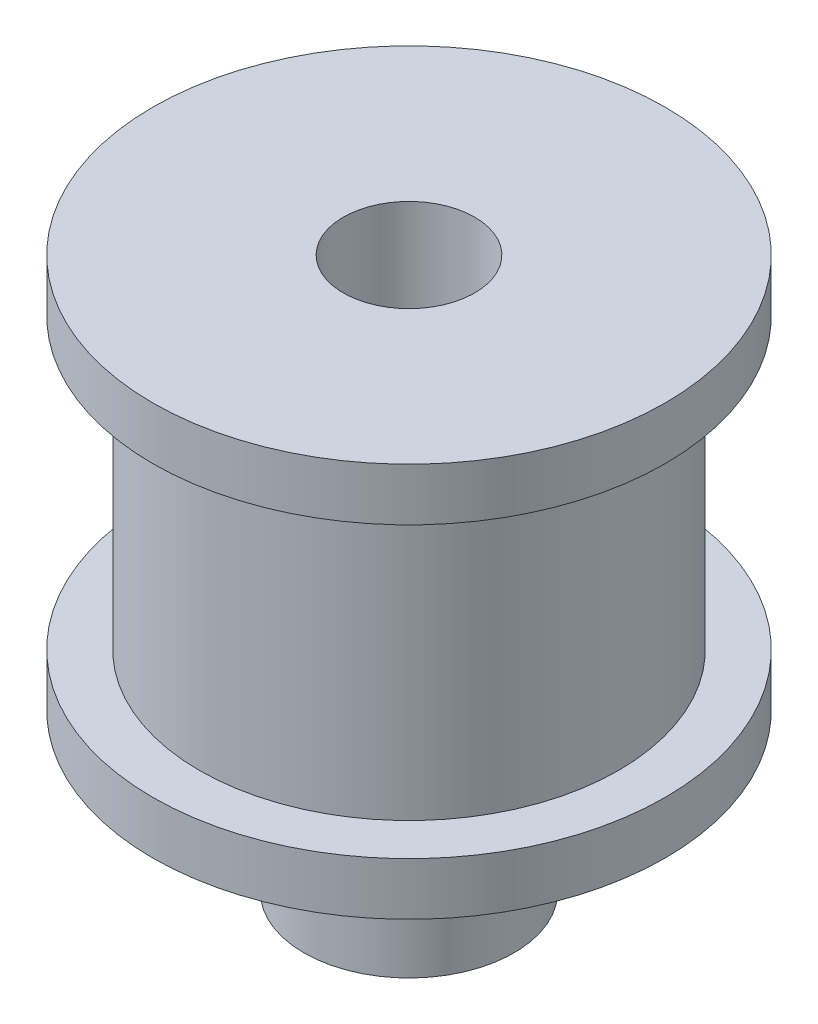
ISO-10303-21;
HEADER;
FILE_DESCRIPTION(('STEP AP214'),'2;1');
FILE_NAME('part.step','',(''),(''),'','','');
FILE_SCHEMA(('AUTOMOTIVE_DESIGN { 1 0 10303 214 1 1 1 1 }'));
ENDSEC;
DATA;
#1=APPLICATION_CONTEXT('core data for automotive mechanical design processes');
#2=APPLICATION_PROTOCOL_DEFINITION('international standard','automotive_design',2000,#1);
#3=PRODUCT_CONTEXT('',#1,'mechanical');
#4=PRODUCT('Part','Part','',(#3));
#5=PRODUCT_RELATED_PRODUCT_CATEGORY('part','',(#4));
#6=PRODUCT_DEFINITION_FORMATION('','',#4);
#7=PRODUCT_DEFINITION_CONTEXT('part definition',#1,'design');
#8=PRODUCT_DEFINITION('design','',#6,#7);
#9=PRODUCT_DEFINITION_SHAPE('','',#8);
#10=(LENGTH_UNIT() NAMED_UNIT(*) SI_UNIT(.MILLI.,.METRE.));
#11=(NAMED_UNIT(*) PLANE_ANGLE_UNIT() SI_UNIT($,.RADIAN.));
#12=(NAMED_UNIT(*) SI_UNIT($,.STERADIAN.) SOLID_ANGLE_UNIT());
#13=UNCERTAINTY_MEASURE_WITH_UNIT(LENGTH_MEASURE(1.E-05),#10,'distance_accuracy_value','');
#14=(GEOMETRIC_REPRESENTATION_CONTEXT(3) GLOBAL_UNCERTAINTY_ASSIGNED_CONTEXT((#13)) GLOBAL_UNIT_ASSIGNED_CONTEXT((#10,
#11,#12)) REPRESENTATION_CONTEXT('',''));
#15=CARTESIAN_POINT('',(0.,0.,0.));
#16=DIRECTION('',(0.,0.,1.));
#17=DIRECTION('',(1.,0.,0.));
#18=AXIS2_PLACEMENT_3D('',#15,#16,#17);
#19=CARTESIAN_POINT('',(0.,0.,0.));
#20=DIRECTION('',(0.,-1.,0.));
#21=DIRECTION('',(0.,0.,-1.));
#22=AXIS2_PLACEMENT_3D('',#19,#20,#21);
#23=CYLINDRICAL_SURFACE('',#22,9.75);
#24=CARTESIAN_POINT('',(0.,8.,0.));
#25=DIRECTION('',(0.,-1.,0.));
#26=DIRECTION('',(0.,0.,-1.));
#27=AXIS2_PLACEMENT_3D('',#24,#25,#26);
#28=CIRCLE('',#27,9.75);
#29=CARTESIAN_POINT('',(0.,8.,-9.75));
#30=VERTEX_POINT('',#29);
#31=EDGE_CURVE('E64',#30,#30,#28,.T.);
#32=ORIENTED_EDGE('',*,*,#31,.T.);
#33=EDGE_LOOP('',(#32));
#34=FACE_BOUND('',#33,.T.);
#35=CARTESIAN_POINT('',(0.,6.,0.));
#36=DIRECTION('',(0.,-1.,0.));
#37=DIRECTION('',(0.,0.,-1.));
#38=AXIS2_PLACEMENT_3D('',#35,#36,#37);
#39=CIRCLE('',#38,9.75);
#40=CARTESIAN_POINT('',(0.,6.,-9.75));
#41=VERTEX_POINT('',#40);
#42=EDGE_CURVE('E10',#41,#41,#39,.T.);
#43=ORIENTED_EDGE('',*,*,#42,.F.);
#44=EDGE_LOOP('',(#43));
#45=FACE_BOUND('',#44,.T.);
#46=ADVANCED_FACE('F30',(#34,#45),#23,.T.);
#47=CARTESIAN_POINT('',(9.75,6.,0.));
#48=DIRECTION('',(0.,-1.,0.));
#49=DIRECTION('',(0.,0.,-1.));
#50=AXIS2_PLACEMENT_3D('',#47,#48,#49);
#51=PLANE('',#50);
#52=ORIENTED_EDGE('',*,*,#42,.T.);
#53=EDGE_LOOP('',(#52));
#54=FACE_BOUND('',#53,.T.);
#55=CARTESIAN_POINT('',(0.,6.,0.));
#56=DIRECTION('',(0.,-1.,0.));
#57=DIRECTION('',(0.,0.,-1.));
#58=AXIS2_PLACEMENT_3D('',#55,#56,#57);
#59=CIRCLE('',#58,4.);
#60=CARTESIAN_POINT('',(0.,6.,-4.));
#61=VERTEX_POINT('',#60);
#62=EDGE_CURVE('E36',#61,#61,#59,.T.);
#63=ORIENTED_EDGE('',*,*,#62,.F.);
#64=EDGE_LOOP('',(#63));
#65=FACE_BOUND('',#64,.T.);
#66=ADVANCED_FACE('F82',(#54,#65),#51,.T.);
#67=CARTESIAN_POINT('',(0.,0.,0.));
#68=DIRECTION('',(0.,-1.,0.));
#69=DIRECTION('',(0.,0.,-1.));
#70=AXIS2_PLACEMENT_3D('',#67,#68,#69);
#71=CYLINDRICAL_SURFACE('',#70,4.);
#72=ORIENTED_EDGE('',*,*,#62,.T.);
#73=EDGE_LOOP('',(#72));
#74=FACE_BOUND('',#73,.T.);
#75=CARTESIAN_POINT('',(0.,0.,0.));
#76=DIRECTION('',(0.,-1.,0.));
#77=DIRECTION('',(0.,0.,-1.));
#78=AXIS2_PLACEMENT_3D('',#75,#76,#77);
#79=CIRCLE('',#78,4.);
#80=CARTESIAN_POINT('',(0.,0.,-4.));
#81=VERTEX_POINT('',#80);
#82=EDGE_CURVE('E40',#81,#81,#79,.T.);
#83=ORIENTED_EDGE('',*,*,#82,.F.);
#84=EDGE_LOOP('',(#83));
#85=FACE_BOUND('',#84,.T.);
#86=ADVANCED_FACE('F86',(#74,#85),#71,.T.);
#87=CARTESIAN_POINT('',(4.,0.,0.));
#88=DIRECTION('',(0.,-1.,0.));
#89=DIRECTION('',(0.,0.,-1.));
#90=AXIS2_PLACEMENT_3D('',#87,#88,#89);
#91=PLANE('',#90);
#92=ORIENTED_EDGE('',*,*,#82,.T.);
#93=EDGE_LOOP('',(#92));
#94=FACE_BOUND('',#93,.T.);
#95=CARTESIAN_POINT('',(0.,0.,0.));
#96=DIRECTION('',(0.,-1.,0.));
#97=DIRECTION('',(0.,0.,-1.));
#98=AXIS2_PLACEMENT_3D('',#95,#96,#97);
#99=CIRCLE('',#98,2.5);
#100=CARTESIAN_POINT('',(0.,0.,-2.5));
#101=VERTEX_POINT('',#100);
#102=EDGE_CURVE('E44',#101,#101,#99,.T.);
#103=ORIENTED_EDGE('',*,*,#102,.F.);
#104=EDGE_LOOP('',(#103));
#105=FACE_BOUND('',#104,.T.);
#106=ADVANCED_FACE('F90',(#94,#105),#91,.T.);
#107=CARTESIAN_POINT('',(0.,0.,0.));
#108=DIRECTION('',(0.,-1.,0.));
#109=DIRECTION('',(0.,0.,-1.));
#110=AXIS2_PLACEMENT_3D('',#107,#108,#109);
#111=CYLINDRICAL_SURFACE('',#110,2.5);
#112=ORIENTED_EDGE('',*,*,#102,.T.);
#113=EDGE_LOOP('',(#112));
#114=FACE_BOUND('',#113,.T.);
#115=CARTESIAN_POINT('',(0.,21.,0.));
#116=DIRECTION('',(0.,-1.,0.));
#117=DIRECTION('',(0.,0.,-1.));
#118=AXIS2_PLACEMENT_3D('',#115,#116,#117);
#119=CIRCLE('',#118,2.5);
#120=CARTESIAN_POINT('',(0.,21.,-2.5));
#121=VERTEX_POINT('',#120);
#122=EDGE_CURVE('E49',#121,#121,#119,.T.);
#123=ORIENTED_EDGE('',*,*,#122,.F.);
#124=EDGE_LOOP('',(#123));
#125=FACE_BOUND('',#124,.T.);
#126=ADVANCED_FACE('F96',(#114,#125),#111,.F.);
#127=CARTESIAN_POINT('',(2.5,21.,0.));
#128=DIRECTION('',(0.,1.,0.));
#129=DIRECTION('',(0.,0.,1.));
#130=AXIS2_PLACEMENT_3D('',#127,#128,#129);
#131=PLANE('',#130);
#132=ORIENTED_EDGE('',*,*,#122,.T.);
#133=EDGE_LOOP('',(#132));
#134=FACE_BOUND('',#133,.T.);
#135=CARTESIAN_POINT('',(0.,21.,0.));
#136=DIRECTION('',(0.,-1.,0.));
#137=DIRECTION('',(0.,0.,-1.));
#138=AXIS2_PLACEMENT_3D('',#135,#136,#137);
#139=CIRCLE('',#138,9.75);
#140=CARTESIAN_POINT('',(0.,21.,-9.75));
#141=VERTEX_POINT('',#140);
#142=EDGE_CURVE('E52',#141,#141,#139,.T.);
#143=ORIENTED_EDGE('',*,*,#142,.F.);
#144=EDGE_LOOP('',(#143));
#145=FACE_BOUND('',#144,.T.);
#146=ADVANCED_FACE('F100',(#134,#145),#131,.T.);
#147=CARTESIAN_POINT('',(0.,0.,0.));
#148=DIRECTION('',(0.,-1.,0.));
#149=DIRECTION('',(0.,0.,-1.));
#150=AXIS2_PLACEMENT_3D('',#147,#148,#149);
#151=CYLINDRICAL_SURFACE('',#150,9.75);
#152=ORIENTED_EDGE('',*,*,#142,.T.);
#153=EDGE_LOOP('',(#152));
#154=FACE_BOUND('',#153,.T.);
#155=CARTESIAN_POINT('',(0.,19.,0.));
#156=DIRECTION('',(0.,-1.,0.));
#157=DIRECTION('',(0.,0.,-1.));
#158=AXIS2_PLACEMENT_3D('',#155,#156,#157);
#159=CIRCLE('',#158,9.75);
#160=CARTESIAN_POINT('',(0.,19.,-9.75));
#161=VERTEX_POINT('',#160);
#162=EDGE_CURVE('E55',#161,#161,#159,.T.);
#163=ORIENTED_EDGE('',*,*,#162,.F.);
#164=EDGE_LOOP('',(#163));
#165=FACE_BOUND('',#164,.T.);
#166=ADVANCED_FACE('F104',(#154,#165),#151,.T.);
#167=CARTESIAN_POINT('',(9.75,19.,0.));
#168=DIRECTION('',(0.,-1.,0.));
#169=DIRECTION('',(0.,0.,-1.));
#170=AXIS2_PLACEMENT_3D('',#167,#168,#169);
#171=PLANE('',#170);
#172=ORIENTED_EDGE('',*,*,#162,.T.);
#173=EDGE_LOOP('',(#172));
#174=FACE_BOUND('',#173,.T.);
#175=CARTESIAN_POINT('',(0.,19.,0.));
#176=DIRECTION('',(0.,-1.,0.));
#177=DIRECTION('',(0.,0.,-1.));
#178=AXIS2_PLACEMENT_3D('',#175,#176,#177);
#179=CIRCLE('',#178,7.975);
#180=CARTESIAN_POINT('',(0.,19.,-7.975));
#181=VERTEX_POINT('',#180);
#182=EDGE_CURVE('E58',#181,#181,#179,.T.);
#183=ORIENTED_EDGE('',*,*,#182,.F.);
#184=EDGE_LOOP('',(#183));
#185=FACE_BOUND('',#184,.T.);
#186=ADVANCED_FACE('F78',(#174,#185),#171,.T.);
#187=CARTESIAN_POINT('',(0.,0.,0.));
#188=DIRECTION('',(0.,-1.,0.));
#189=DIRECTION('',(0.,0.,-1.));
#190=AXIS2_PLACEMENT_3D('',#187,#188,#189);
#191=CYLINDRICAL_SURFACE('',#190,7.975);
#192=ORIENTED_EDGE('',*,*,#182,.T.);
#193=EDGE_LOOP('',(#192));
#194=FACE_BOUND('',#193,.T.);
#195=CARTESIAN_POINT('',(0.,8.,0.));
#196=DIRECTION('',(0.,-1.,0.));
#197=DIRECTION('',(0.,0.,-1.));
#198=AXIS2_PLACEMENT_3D('',#195,#196,#197);
#199=CIRCLE('',#198,7.975);
#200=CARTESIAN_POINT('',(0.,8.,-7.975));
#201=VERTEX_POINT('',#200);
#202=EDGE_CURVE('E61',#201,#201,#199,.T.);
#203=ORIENTED_EDGE('',*,*,#202,.F.);
#204=EDGE_LOOP('',(#203));
#205=FACE_BOUND('',#204,.T.);
#206=ADVANCED_FACE('F72',(#194,#205),#191,.T.);
#207=CARTESIAN_POINT('',(7.975,8.,0.));
#208=DIRECTION('',(0.,1.,0.));
#209=DIRECTION('',(0.,0.,1.));
#210=AXIS2_PLACEMENT_3D('',#207,#208,#209);
#211=PLANE('',#210);
#212=ORIENTED_EDGE('',*,*,#202,.T.);
#213=EDGE_LOOP('',(#212));
#214=FACE_BOUND('',#213,.T.);
#215=ORIENTED_EDGE('',*,*,#31,.F.);
#216=EDGE_LOOP('',(#215));
#217=FACE_BOUND('',#216,.T.);
#218=ADVANCED_FACE('F70',(#214,#217),#211,.T.);
#219=CLOSED_SHELL('',(#46,#66,#86,#106,#126,#146,#166,#186,#206,#218));
#220=MANIFOLD_SOLID_BREP('B2',#219);
#221=ADVANCED_BREP_SHAPE_REPRESENTATION('',(#18,#220),#14);
#222=SHAPE_DEFINITION_REPRESENTATION(#9,#221);
ENDSEC;
END-ISO-10303-21;
